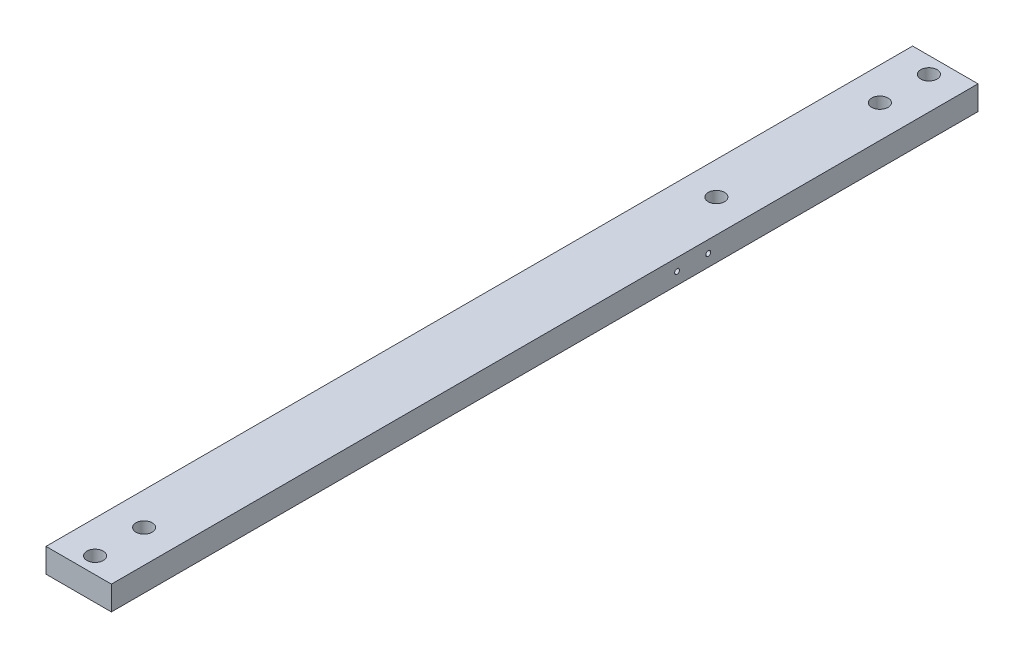
ISO-10303-21;
HEADER;
FILE_DESCRIPTION(('STEP AP214'),'2;1');
FILE_NAME('part.step','',(''),(''),'','','');
FILE_SCHEMA(('AUTOMOTIVE_DESIGN { 1 0 10303 214 1 1 1 1 }'));
ENDSEC;
DATA;
#1=APPLICATION_CONTEXT('core data for automotive mechanical design processes');
#2=APPLICATION_PROTOCOL_DEFINITION('international standard','automotive_design',2000,#1);
#3=PRODUCT_CONTEXT('',#1,'mechanical');
#4=PRODUCT('Part','Part','',(#3));
#5=PRODUCT_RELATED_PRODUCT_CATEGORY('part','',(#4));
#6=PRODUCT_DEFINITION_FORMATION('','',#4);
#7=PRODUCT_DEFINITION_CONTEXT('part definition',#1,'design');
#8=PRODUCT_DEFINITION('design','',#6,#7);
#9=PRODUCT_DEFINITION_SHAPE('','',#8);
#10=(LENGTH_UNIT() NAMED_UNIT(*) SI_UNIT(.MILLI.,.METRE.));
#11=(NAMED_UNIT(*) PLANE_ANGLE_UNIT() SI_UNIT($,.RADIAN.));
#12=(NAMED_UNIT(*) SI_UNIT($,.STERADIAN.) SOLID_ANGLE_UNIT());
#13=UNCERTAINTY_MEASURE_WITH_UNIT(LENGTH_MEASURE(1.E-05),#10,'distance_accuracy_value','');
#14=(GEOMETRIC_REPRESENTATION_CONTEXT(3) GLOBAL_UNCERTAINTY_ASSIGNED_CONTEXT((#13)) GLOBAL_UNIT_ASSIGNED_CONTEXT((#10,
#11,#12)) REPRESENTATION_CONTEXT('',''));
#15=CARTESIAN_POINT('',(0.,0.,0.));
#16=DIRECTION('',(0.,0.,1.));
#17=DIRECTION('',(1.,0.,0.));
#18=AXIS2_PLACEMENT_3D('',#15,#16,#17);
#19=CARTESIAN_POINT('',(4.,0.,8.));
#20=DIRECTION('',(0.,1.,0.));
#21=DIRECTION('',(0.,0.,1.));
#22=AXIS2_PLACEMENT_3D('',#19,#20,#21);
#23=CYLINDRICAL_SURFACE('',#22,0.7);
#24=CARTESIAN_POINT('',(4.,0.,8.));
#25=DIRECTION('',(0.,1.,0.));
#26=DIRECTION('',(0.,0.,1.));
#27=AXIS2_PLACEMENT_3D('',#24,#25,#26);
#28=CIRCLE('',#27,0.7);
#29=CARTESIAN_POINT('',(4.,0.,8.7));
#30=VERTEX_POINT('',#29);
#31=EDGE_CURVE('E138',#30,#30,#28,.T.);
#32=ORIENTED_EDGE('',*,*,#31,.F.);
#33=EDGE_LOOP('',(#32));
#34=FACE_BOUND('',#33,.T.);
#35=CARTESIAN_POINT('',(4.,1.45,8.));
#36=DIRECTION('',(0.,1.,0.));
#37=DIRECTION('',(0.,0.,1.));
#38=AXIS2_PLACEMENT_3D('',#35,#36,#37);
#39=CIRCLE('',#38,0.7);
#40=CARTESIAN_POINT('',(4.,1.45,8.7));
#41=VERTEX_POINT('',#40);
#42=EDGE_CURVE('E39',#41,#41,#39,.F.);
#43=ORIENTED_EDGE('',*,*,#42,.F.);
#44=EDGE_LOOP('',(#43));
#45=FACE_BOUND('',#44,.T.);
#46=ADVANCED_FACE('F35',(#34,#45),#23,.F.);
#47=CARTESIAN_POINT('',(4.00000000000001,0.,98.));
#48=DIRECTION('',(0.,1.,0.));
#49=DIRECTION('',(0.,0.,1.));
#50=AXIS2_PLACEMENT_3D('',#47,#48,#49);
#51=CYLINDRICAL_SURFACE('',#50,0.700000000000013);
#52=CARTESIAN_POINT('',(4.00000000000001,0.,98.));
#53=DIRECTION('',(0.,1.,0.));
#54=DIRECTION('',(0.,0.,1.));
#55=AXIS2_PLACEMENT_3D('',#52,#53,#54);
#56=CIRCLE('',#55,0.700000000000013);
#57=CARTESIAN_POINT('',(4.00000000000001,0.,98.7));
#58=VERTEX_POINT('',#57);
#59=EDGE_CURVE('E134',#58,#58,#56,.T.);
#60=ORIENTED_EDGE('',*,*,#59,.F.);
#61=EDGE_LOOP('',(#60));
#62=FACE_BOUND('',#61,.T.);
#63=CARTESIAN_POINT('',(4.00000000000001,1.45,98.));
#64=DIRECTION('',(0.,1.,0.));
#65=DIRECTION('',(0.,0.,1.));
#66=AXIS2_PLACEMENT_3D('',#63,#64,#65);
#67=CIRCLE('',#66,0.700000000000013);
#68=CARTESIAN_POINT('',(4.00000000000001,1.45,98.7));
#69=VERTEX_POINT('',#68);
#70=EDGE_CURVE('E120',#69,#69,#67,.F.);
#71=ORIENTED_EDGE('',*,*,#70,.F.);
#72=EDGE_LOOP('',(#71));
#73=FACE_BOUND('',#72,.T.);
#74=ADVANCED_FACE('F147',(#62,#73),#51,.F.);
#75=CARTESIAN_POINT('',(4.00000000000001,0.,104.));
#76=DIRECTION('',(0.,1.,0.));
#77=DIRECTION('',(0.,0.,1.));
#78=AXIS2_PLACEMENT_3D('',#75,#76,#77);
#79=CYLINDRICAL_SURFACE('',#78,0.700000000000011);
#80=CARTESIAN_POINT('',(4.00000000000001,0.,104.));
#81=DIRECTION('',(0.,1.,0.));
#82=DIRECTION('',(0.,0.,1.));
#83=AXIS2_PLACEMENT_3D('',#80,#81,#82);
#84=CIRCLE('',#83,0.700000000000011);
#85=CARTESIAN_POINT('',(4.00000000000001,0.,104.7));
#86=VERTEX_POINT('',#85);
#87=EDGE_CURVE('E129',#86,#86,#84,.T.);
#88=ORIENTED_EDGE('',*,*,#87,.F.);
#89=EDGE_LOOP('',(#88));
#90=FACE_BOUND('',#89,.T.);
#91=CARTESIAN_POINT('',(4.00000000000001,1.45,104.));
#92=DIRECTION('',(0.,1.,0.));
#93=DIRECTION('',(0.,0.,1.));
#94=AXIS2_PLACEMENT_3D('',#91,#92,#93);
#95=CIRCLE('',#94,0.700000000000011);
#96=CARTESIAN_POINT('',(4.00000000000001,1.45,104.7));
#97=VERTEX_POINT('',#96);
#98=EDGE_CURVE('E118',#97,#97,#95,.F.);
#99=ORIENTED_EDGE('',*,*,#98,.F.);
#100=EDGE_LOOP('',(#99));
#101=FACE_BOUND('',#100,.T.);
#102=ADVANCED_FACE('F150',(#90,#101),#79,.F.);
#103=CARTESIAN_POINT('',(4.00000000000001,0.,28.));
#104=DIRECTION('',(0.,1.,0.));
#105=DIRECTION('',(0.,0.,1.));
#106=AXIS2_PLACEMENT_3D('',#103,#104,#105);
#107=CYLINDRICAL_SURFACE('',#106,0.699999999999999);
#108=CARTESIAN_POINT('',(4.00000000000001,0.,28.));
#109=DIRECTION('',(0.,1.,0.));
#110=DIRECTION('',(0.,0.,1.));
#111=AXIS2_PLACEMENT_3D('',#108,#109,#110);
#112=CIRCLE('',#111,0.699999999999999);
#113=CARTESIAN_POINT('',(4.00000000000001,0.,28.7));
#114=VERTEX_POINT('',#113);
#115=EDGE_CURVE('E125',#114,#114,#112,.T.);
#116=ORIENTED_EDGE('',*,*,#115,.F.);
#117=EDGE_LOOP('',(#116));
#118=FACE_BOUND('',#117,.T.);
#119=CARTESIAN_POINT('',(4.00000000000001,1.45,28.));
#120=DIRECTION('',(0.,1.,0.));
#121=DIRECTION('',(0.,0.,1.));
#122=AXIS2_PLACEMENT_3D('',#119,#120,#121);
#123=CIRCLE('',#122,0.699999999999999);
#124=CARTESIAN_POINT('',(4.00000000000001,1.45,28.7));
#125=VERTEX_POINT('',#124);
#126=EDGE_CURVE('E114',#125,#125,#123,.F.);
#127=ORIENTED_EDGE('',*,*,#126,.F.);
#128=EDGE_LOOP('',(#127));
#129=FACE_BOUND('',#128,.T.);
#130=ADVANCED_FACE('F156',(#118,#129),#107,.F.);
#131=CARTESIAN_POINT('',(4.,0.,2.));
#132=DIRECTION('',(0.,1.,0.));
#133=DIRECTION('',(0.,0.,1.));
#134=AXIS2_PLACEMENT_3D('',#131,#132,#133);
#135=CYLINDRICAL_SURFACE('',#134,0.7);
#136=CARTESIAN_POINT('',(4.,0.,2.));
#137=DIRECTION('',(0.,1.,0.));
#138=DIRECTION('',(0.,0.,1.));
#139=AXIS2_PLACEMENT_3D('',#136,#137,#138);
#140=CIRCLE('',#139,0.7);
#141=CARTESIAN_POINT('',(4.,0.,2.7));
#142=VERTEX_POINT('',#141);
#143=EDGE_CURVE('E105',#142,#142,#140,.T.);
#144=ORIENTED_EDGE('',*,*,#143,.F.);
#145=EDGE_LOOP('',(#144));
#146=FACE_BOUND('',#145,.T.);
#147=CARTESIAN_POINT('',(4.,1.45,2.));
#148=DIRECTION('',(0.,1.,0.));
#149=DIRECTION('',(0.,0.,1.));
#150=AXIS2_PLACEMENT_3D('',#147,#148,#149);
#151=CIRCLE('',#150,0.7);
#152=CARTESIAN_POINT('',(4.,1.45,2.7));
#153=VERTEX_POINT('',#152);
#154=EDGE_CURVE('E111',#153,#153,#151,.F.);
#155=ORIENTED_EDGE('',*,*,#154,.F.);
#156=EDGE_LOOP('',(#155));
#157=FACE_BOUND('',#156,.T.);
#158=ADVANCED_FACE('F179',(#146,#157),#135,.F.);
#159=CARTESIAN_POINT('',(0.,2.95,0.));
#160=DIRECTION('',(1.,0.,0.));
#161=DIRECTION('',(0.,0.,-1.));
#162=AXIS2_PLACEMENT_3D('',#159,#160,#161);
#163=PLANE('',#162);
#164=CARTESIAN_POINT('',(0.,1.47500000004995,33.));
#165=DIRECTION('',(1.,0.,0.));
#166=DIRECTION('',(0.,0.,-1.));
#167=AXIS2_PLACEMENT_3D('',#164,#165,#166);
#168=CIRCLE('',#167,0.300000000000004);
#169=CARTESIAN_POINT('',(0.,1.47500000004995,32.7));
#170=VERTEX_POINT('',#169);
#171=EDGE_CURVE('E189',#170,#170,#168,.T.);
#172=ORIENTED_EDGE('',*,*,#171,.T.);
#173=EDGE_LOOP('',(#172));
#174=FACE_BOUND('',#173,.T.);
#175=CARTESIAN_POINT('',(0.,1.47500000004995,36.8));
#176=DIRECTION('',(1.,0.,0.));
#177=DIRECTION('',(0.,0.,-1.));
#178=AXIS2_PLACEMENT_3D('',#175,#176,#177);
#179=CIRCLE('',#178,0.300000000000004);
#180=CARTESIAN_POINT('',(0.,1.47500000004995,36.5));
#181=VERTEX_POINT('',#180);
#182=EDGE_CURVE('E193',#181,#181,#179,.T.);
#183=ORIENTED_EDGE('',*,*,#182,.T.);
#184=EDGE_LOOP('',(#183));
#185=FACE_BOUND('',#184,.T.);
#186=DIRECTION('',(0.,0.,1.));
#187=VECTOR('',#186,1.);
#188=CARTESIAN_POINT('',(0.,0.,0.));
#189=LINE('',#188,#187);
#190=CARTESIAN_POINT('',(0.,0.,0.));
#191=VERTEX_POINT('',#190);
#192=CARTESIAN_POINT('',(0.,0.,106.));
#193=VERTEX_POINT('',#192);
#194=EDGE_CURVE('E102',#191,#193,#189,.T.);
#195=ORIENTED_EDGE('',*,*,#194,.T.);
#196=DIRECTION('',(0.,-1.,0.));
#197=VECTOR('',#196,1.);
#198=CARTESIAN_POINT('',(0.,2.95,106.));
#199=LINE('',#198,#197);
#200=CARTESIAN_POINT('',(0.,2.95,106.));
#201=VERTEX_POINT('',#200);
#202=EDGE_CURVE('E11',#201,#193,#199,.T.);
#203=ORIENTED_EDGE('',*,*,#202,.F.);
#204=DIRECTION('',(0.,0.,1.));
#205=VECTOR('',#204,1.);
#206=CARTESIAN_POINT('',(0.,2.95,0.));
#207=LINE('',#206,#205);
#208=CARTESIAN_POINT('',(0.,2.95,0.));
#209=VERTEX_POINT('',#208);
#210=EDGE_CURVE('E89',#209,#201,#207,.T.);
#211=ORIENTED_EDGE('',*,*,#210,.F.);
#212=DIRECTION('',(0.,-1.,0.));
#213=VECTOR('',#212,1.);
#214=CARTESIAN_POINT('',(0.,2.95,0.));
#215=LINE('',#214,#213);
#216=EDGE_CURVE('E98',#209,#191,#215,.T.);
#217=ORIENTED_EDGE('',*,*,#216,.T.);
#218=EDGE_LOOP('',(#195,#203,#211,#217));
#219=FACE_BOUND('',#218,.T.);
#220=ADVANCED_FACE('F37',(#174,#185,#219),#163,.F.);
#221=CARTESIAN_POINT('',(0.,2.95,106.));
#222=DIRECTION('',(0.,0.,-1.));
#223=DIRECTION('',(-1.,0.,0.));
#224=AXIS2_PLACEMENT_3D('',#221,#222,#223);
#225=PLANE('',#224);
#226=DIRECTION('',(1.,0.,0.));
#227=VECTOR('',#226,1.);
#228=CARTESIAN_POINT('',(0.,0.,106.));
#229=LINE('',#228,#227);
#230=CARTESIAN_POINT('',(8.00000000000001,0.,106.));
#231=VERTEX_POINT('',#230);
#232=EDGE_CURVE('E93',#193,#231,#229,.T.);
#233=ORIENTED_EDGE('',*,*,#232,.T.);
#234=DIRECTION('',(0.,-1.,0.));
#235=VECTOR('',#234,1.);
#236=CARTESIAN_POINT('',(8.00000000000001,2.95,106.));
#237=LINE('',#236,#235);
#238=CARTESIAN_POINT('',(8.00000000000001,2.95,106.));
#239=VERTEX_POINT('',#238);
#240=EDGE_CURVE('E45',#239,#231,#237,.T.);
#241=ORIENTED_EDGE('',*,*,#240,.F.);
#242=DIRECTION('',(1.,0.,0.));
#243=VECTOR('',#242,1.);
#244=CARTESIAN_POINT('',(0.,2.95,106.));
#245=LINE('',#244,#243);
#246=EDGE_CURVE('E84',#201,#239,#245,.T.);
#247=ORIENTED_EDGE('',*,*,#246,.F.);
#248=ORIENTED_EDGE('',*,*,#202,.T.);
#249=EDGE_LOOP('',(#233,#241,#247,#248));
#250=FACE_BOUND('',#249,.T.);
#251=ADVANCED_FACE('F92',(#250),#225,.F.);
#252=CARTESIAN_POINT('',(8.,2.95,0.));
#253=DIRECTION('',(-1.,0.,0.));
#254=DIRECTION('',(0.,0.,1.));
#255=AXIS2_PLACEMENT_3D('',#252,#253,#254);
#256=PLANE('',#255);
#257=CARTESIAN_POINT('',(8.,1.47500000004995,33.));
#258=DIRECTION('',(1.,0.,0.));
#259=DIRECTION('',(0.,0.,-1.));
#260=AXIS2_PLACEMENT_3D('',#257,#258,#259);
#261=CIRCLE('',#260,0.300000000000004);
#262=CARTESIAN_POINT('',(8.,1.47500000004995,32.7));
#263=VERTEX_POINT('',#262);
#264=EDGE_CURVE('E200',#263,#263,#261,.T.);
#265=ORIENTED_EDGE('',*,*,#264,.F.);
#266=EDGE_LOOP('',(#265));
#267=FACE_BOUND('',#266,.T.);
#268=CARTESIAN_POINT('',(8.,1.47500000004995,36.8));
#269=DIRECTION('',(1.,0.,0.));
#270=DIRECTION('',(0.,0.,-1.));
#271=AXIS2_PLACEMENT_3D('',#268,#269,#270);
#272=CIRCLE('',#271,0.300000000000004);
#273=CARTESIAN_POINT('',(8.,1.47500000004995,36.5));
#274=VERTEX_POINT('',#273);
#275=EDGE_CURVE('E197',#274,#274,#272,.T.);
#276=ORIENTED_EDGE('',*,*,#275,.F.);
#277=EDGE_LOOP('',(#276));
#278=FACE_BOUND('',#277,.T.);
#279=DIRECTION('',(0.,0.,-1.));
#280=VECTOR('',#279,1.);
#281=CARTESIAN_POINT('',(8.,0.,0.));
#282=LINE('',#281,#280);
#283=CARTESIAN_POINT('',(8.,0.,0.));
#284=VERTEX_POINT('',#283);
#285=EDGE_CURVE('E71',#231,#284,#282,.T.);
#286=ORIENTED_EDGE('',*,*,#285,.T.);
#287=DIRECTION('',(0.,-1.,0.));
#288=VECTOR('',#287,1.);
#289=CARTESIAN_POINT('',(8.,2.95,0.));
#290=LINE('',#289,#288);
#291=CARTESIAN_POINT('',(8.,2.95,0.));
#292=VERTEX_POINT('',#291);
#293=EDGE_CURVE('E94',#292,#284,#290,.T.);
#294=ORIENTED_EDGE('',*,*,#293,.F.);
#295=DIRECTION('',(0.,0.,-1.));
#296=VECTOR('',#295,1.);
#297=CARTESIAN_POINT('',(8.,2.95,0.));
#298=LINE('',#297,#296);
#299=EDGE_CURVE('E87',#239,#292,#298,.T.);
#300=ORIENTED_EDGE('',*,*,#299,.F.);
#301=ORIENTED_EDGE('',*,*,#240,.T.);
#302=EDGE_LOOP('',(#286,#294,#300,#301));
#303=FACE_BOUND('',#302,.T.);
#304=ADVANCED_FACE('F96',(#267,#278,#303),#256,.F.);
#305=CARTESIAN_POINT('',(0.,2.95,0.));
#306=DIRECTION('',(0.,0.,1.));
#307=DIRECTION('',(1.,0.,0.));
#308=AXIS2_PLACEMENT_3D('',#305,#306,#307);
#309=PLANE('',#308);
#310=DIRECTION('',(-1.,0.,0.));
#311=VECTOR('',#310,1.);
#312=CARTESIAN_POINT('',(0.,0.,0.));
#313=LINE('',#312,#311);
#314=EDGE_CURVE('E77',#284,#191,#313,.T.);
#315=ORIENTED_EDGE('',*,*,#314,.T.);
#316=ORIENTED_EDGE('',*,*,#216,.F.);
#317=DIRECTION('',(-1.,0.,0.));
#318=VECTOR('',#317,1.);
#319=CARTESIAN_POINT('',(0.,2.95,0.));
#320=LINE('',#319,#318);
#321=EDGE_CURVE('E54',#292,#209,#320,.T.);
#322=ORIENTED_EDGE('',*,*,#321,.F.);
#323=ORIENTED_EDGE('',*,*,#293,.T.);
#324=EDGE_LOOP('',(#315,#316,#322,#323));
#325=FACE_BOUND('',#324,.T.);
#326=ADVANCED_FACE('F165',(#325),#309,.F.);
#327=CARTESIAN_POINT('',(0.,2.95,0.));
#328=DIRECTION('',(0.,1.,0.));
#329=DIRECTION('',(0.,0.,1.));
#330=AXIS2_PLACEMENT_3D('',#327,#328,#329);
#331=PLANE('',#330);
#332=CARTESIAN_POINT('',(4.,2.95,2.));
#333=DIRECTION('',(0.,1.,0.));
#334=DIRECTION('',(0.,0.,1.));
#335=AXIS2_PLACEMENT_3D('',#332,#333,#334);
#336=CIRCLE('',#335,1.);
#337=CARTESIAN_POINT('',(4.,2.95,3.));
#338=VERTEX_POINT('',#337);
#339=EDGE_CURVE('E217',#338,#338,#336,.T.);
#340=ORIENTED_EDGE('',*,*,#339,.F.);
#341=EDGE_LOOP('',(#340));
#342=FACE_BOUND('',#341,.T.);
#343=CARTESIAN_POINT('',(4.00000000000001,2.95,104.));
#344=DIRECTION('',(0.,1.,0.));
#345=DIRECTION('',(0.,0.,1.));
#346=AXIS2_PLACEMENT_3D('',#343,#344,#345);
#347=CIRCLE('',#346,0.999999999999998);
#348=CARTESIAN_POINT('',(4.00000000000001,2.95,105.));
#349=VERTEX_POINT('',#348);
#350=EDGE_CURVE('E224',#349,#349,#347,.T.);
#351=ORIENTED_EDGE('',*,*,#350,.F.);
#352=EDGE_LOOP('',(#351));
#353=FACE_BOUND('',#352,.T.);
#354=CARTESIAN_POINT('',(4.00000000000001,2.95,98.));
#355=DIRECTION('',(0.,1.,0.));
#356=DIRECTION('',(0.,0.,1.));
#357=AXIS2_PLACEMENT_3D('',#354,#355,#356);
#358=CIRCLE('',#357,1.);
#359=CARTESIAN_POINT('',(4.00000000000001,2.95,99.));
#360=VERTEX_POINT('',#359);
#361=EDGE_CURVE('E204',#360,#360,#358,.T.);
#362=ORIENTED_EDGE('',*,*,#361,.F.);
#363=EDGE_LOOP('',(#362));
#364=FACE_BOUND('',#363,.T.);
#365=CARTESIAN_POINT('',(4.00000000000001,2.95,28.));
#366=DIRECTION('',(0.,1.,0.));
#367=DIRECTION('',(0.,0.,1.));
#368=AXIS2_PLACEMENT_3D('',#365,#366,#367);
#369=CIRCLE('',#368,1.);
#370=CARTESIAN_POINT('',(4.00000000000001,2.95,29.));
#371=VERTEX_POINT('',#370);
#372=EDGE_CURVE('E211',#371,#371,#369,.T.);
#373=ORIENTED_EDGE('',*,*,#372,.F.);
#374=EDGE_LOOP('',(#373));
#375=FACE_BOUND('',#374,.T.);
#376=CARTESIAN_POINT('',(4.,2.95,8.));
#377=DIRECTION('',(0.,1.,0.));
#378=DIRECTION('',(0.,0.,1.));
#379=AXIS2_PLACEMENT_3D('',#376,#377,#378);
#380=CIRCLE('',#379,1.);
#381=CARTESIAN_POINT('',(4.,2.95,9.));
#382=VERTEX_POINT('',#381);
#383=EDGE_CURVE('E220',#382,#382,#380,.T.);
#384=ORIENTED_EDGE('',*,*,#383,.F.);
#385=EDGE_LOOP('',(#384));
#386=FACE_BOUND('',#385,.T.);
#387=ORIENTED_EDGE('',*,*,#210,.T.);
#388=ORIENTED_EDGE('',*,*,#246,.T.);
#389=ORIENTED_EDGE('',*,*,#299,.T.);
#390=ORIENTED_EDGE('',*,*,#321,.T.);
#391=EDGE_LOOP('',(#387,#388,#389,#390));
#392=FACE_BOUND('',#391,.T.);
#393=ADVANCED_FACE('F85',(#342,#353,#364,#375,#386,#392),#331,.T.);
#394=CARTESIAN_POINT('',(0.,0.,0.));
#395=DIRECTION('',(0.,1.,0.));
#396=DIRECTION('',(0.,0.,1.));
#397=AXIS2_PLACEMENT_3D('',#394,#395,#396);
#398=PLANE('',#397);
#399=ORIENTED_EDGE('',*,*,#143,.T.);
#400=EDGE_LOOP('',(#399));
#401=FACE_BOUND('',#400,.T.);
#402=ORIENTED_EDGE('',*,*,#115,.T.);
#403=EDGE_LOOP('',(#402));
#404=FACE_BOUND('',#403,.T.);
#405=ORIENTED_EDGE('',*,*,#87,.T.);
#406=EDGE_LOOP('',(#405));
#407=FACE_BOUND('',#406,.T.);
#408=ORIENTED_EDGE('',*,*,#59,.T.);
#409=EDGE_LOOP('',(#408));
#410=FACE_BOUND('',#409,.T.);
#411=ORIENTED_EDGE('',*,*,#31,.T.);
#412=EDGE_LOOP('',(#411));
#413=FACE_BOUND('',#412,.T.);
#414=ORIENTED_EDGE('',*,*,#194,.F.);
#415=ORIENTED_EDGE('',*,*,#314,.F.);
#416=ORIENTED_EDGE('',*,*,#285,.F.);
#417=ORIENTED_EDGE('',*,*,#232,.F.);
#418=EDGE_LOOP('',(#414,#415,#416,#417));
#419=FACE_BOUND('',#418,.T.);
#420=ADVANCED_FACE('F144',(#401,#404,#407,#410,#413,#419),#398,.F.);
#421=CARTESIAN_POINT('',(4.,1.45,2.));
#422=DIRECTION('',(0.,1.,0.));
#423=DIRECTION('',(0.,0.,1.));
#424=AXIS2_PLACEMENT_3D('',#421,#422,#423);
#425=PLANE('',#424);
#426=CARTESIAN_POINT('',(4.,1.45,2.));
#427=DIRECTION('',(0.,1.,0.));
#428=DIRECTION('',(0.,0.,1.));
#429=AXIS2_PLACEMENT_3D('',#426,#427,#428);
#430=CIRCLE('',#429,1.);
#431=CARTESIAN_POINT('',(4.,1.45,3.));
#432=VERTEX_POINT('',#431);
#433=EDGE_CURVE('E221',#432,#432,#430,.T.);
#434=ORIENTED_EDGE('',*,*,#433,.T.);
#435=EDGE_LOOP('',(#434));
#436=FACE_BOUND('',#435,.T.);
#437=ORIENTED_EDGE('',*,*,#154,.T.);
#438=EDGE_LOOP('',(#437));
#439=FACE_BOUND('',#438,.T.);
#440=ADVANCED_FACE('F169',(#436,#439),#425,.T.);
#441=CARTESIAN_POINT('',(4.,1.45,2.));
#442=DIRECTION('',(0.,1.,0.));
#443=DIRECTION('',(0.,0.,1.));
#444=AXIS2_PLACEMENT_3D('',#441,#442,#443);
#445=CYLINDRICAL_SURFACE('',#444,1.);
#446=ORIENTED_EDGE('',*,*,#433,.F.);
#447=EDGE_LOOP('',(#446));
#448=FACE_BOUND('',#447,.T.);
#449=ORIENTED_EDGE('',*,*,#339,.T.);
#450=EDGE_LOOP('',(#449));
#451=FACE_BOUND('',#450,.T.);
#452=ADVANCED_FACE('F238',(#448,#451),#445,.F.);
#453=CARTESIAN_POINT('',(4.00000000000001,1.45,28.));
#454=DIRECTION('',(0.,1.,0.));
#455=DIRECTION('',(0.,0.,1.));
#456=AXIS2_PLACEMENT_3D('',#453,#454,#455);
#457=PLANE('',#456);
#458=CARTESIAN_POINT('',(4.00000000000001,1.45,28.));
#459=DIRECTION('',(0.,1.,0.));
#460=DIRECTION('',(0.,0.,1.));
#461=AXIS2_PLACEMENT_3D('',#458,#459,#460);
#462=CIRCLE('',#461,1.);
#463=CARTESIAN_POINT('',(4.00000000000001,1.45,29.));
#464=VERTEX_POINT('',#463);
#465=EDGE_CURVE('E214',#464,#464,#462,.T.);
#466=ORIENTED_EDGE('',*,*,#465,.T.);
#467=EDGE_LOOP('',(#466));
#468=FACE_BOUND('',#467,.T.);
#469=ORIENTED_EDGE('',*,*,#126,.T.);
#470=EDGE_LOOP('',(#469));
#471=FACE_BOUND('',#470,.T.);
#472=ADVANCED_FACE('F244',(#468,#471),#457,.T.);
#473=CARTESIAN_POINT('',(4.00000000000001,1.45,28.));
#474=DIRECTION('',(0.,1.,0.));
#475=DIRECTION('',(0.,0.,1.));
#476=AXIS2_PLACEMENT_3D('',#473,#474,#475);
#477=CYLINDRICAL_SURFACE('',#476,1.);
#478=ORIENTED_EDGE('',*,*,#465,.F.);
#479=EDGE_LOOP('',(#478));
#480=FACE_BOUND('',#479,.T.);
#481=ORIENTED_EDGE('',*,*,#372,.T.);
#482=EDGE_LOOP('',(#481));
#483=FACE_BOUND('',#482,.T.);
#484=ADVANCED_FACE('F257',(#480,#483),#477,.F.);
#485=CARTESIAN_POINT('',(4.00000000000001,1.45,104.));
#486=DIRECTION('',(0.,1.,0.));
#487=DIRECTION('',(0.,0.,1.));
#488=AXIS2_PLACEMENT_3D('',#485,#486,#487);
#489=PLANE('',#488);
#490=CARTESIAN_POINT('',(4.00000000000001,1.45,104.));
#491=DIRECTION('',(0.,1.,0.));
#492=DIRECTION('',(0.,0.,1.));
#493=AXIS2_PLACEMENT_3D('',#490,#491,#492);
#494=CIRCLE('',#493,0.999999999999998);
#495=CARTESIAN_POINT('',(4.00000000000001,1.45,105.));
#496=VERTEX_POINT('',#495);
#497=EDGE_CURVE('E207',#496,#496,#494,.T.);
#498=ORIENTED_EDGE('',*,*,#497,.T.);
#499=EDGE_LOOP('',(#498));
#500=FACE_BOUND('',#499,.T.);
#501=ORIENTED_EDGE('',*,*,#98,.T.);
#502=EDGE_LOOP('',(#501));
#503=FACE_BOUND('',#502,.T.);
#504=ADVANCED_FACE('F253',(#500,#503),#489,.T.);
#505=CARTESIAN_POINT('',(4.00000000000001,1.45,104.));
#506=DIRECTION('',(0.,1.,0.));
#507=DIRECTION('',(0.,0.,1.));
#508=AXIS2_PLACEMENT_3D('',#505,#506,#507);
#509=CYLINDRICAL_SURFACE('',#508,0.999999999999998);
#510=ORIENTED_EDGE('',*,*,#497,.F.);
#511=EDGE_LOOP('',(#510));
#512=FACE_BOUND('',#511,.T.);
#513=ORIENTED_EDGE('',*,*,#350,.T.);
#514=EDGE_LOOP('',(#513));
#515=FACE_BOUND('',#514,.T.);
#516=ADVANCED_FACE('F249',(#512,#515),#509,.F.);
#517=CARTESIAN_POINT('',(4.00000000000001,1.45,98.));
#518=DIRECTION('',(0.,1.,0.));
#519=DIRECTION('',(0.,0.,1.));
#520=AXIS2_PLACEMENT_3D('',#517,#518,#519);
#521=PLANE('',#520);
#522=CARTESIAN_POINT('',(4.00000000000001,1.45,98.));
#523=DIRECTION('',(0.,1.,0.));
#524=DIRECTION('',(0.,0.,1.));
#525=AXIS2_PLACEMENT_3D('',#522,#523,#524);
#526=CIRCLE('',#525,1.);
#527=CARTESIAN_POINT('',(4.00000000000001,1.45,99.));
#528=VERTEX_POINT('',#527);
#529=EDGE_CURVE('E208',#528,#528,#526,.T.);
#530=ORIENTED_EDGE('',*,*,#529,.T.);
#531=EDGE_LOOP('',(#530));
#532=FACE_BOUND('',#531,.T.);
#533=ORIENTED_EDGE('',*,*,#70,.T.);
#534=EDGE_LOOP('',(#533));
#535=FACE_BOUND('',#534,.T.);
#536=ADVANCED_FACE('F252',(#532,#535),#521,.T.);
#537=CARTESIAN_POINT('',(4.00000000000001,1.45,98.));
#538=DIRECTION('',(0.,1.,0.));
#539=DIRECTION('',(0.,0.,1.));
#540=AXIS2_PLACEMENT_3D('',#537,#538,#539);
#541=CYLINDRICAL_SURFACE('',#540,1.);
#542=ORIENTED_EDGE('',*,*,#529,.F.);
#543=EDGE_LOOP('',(#542));
#544=FACE_BOUND('',#543,.T.);
#545=ORIENTED_EDGE('',*,*,#361,.T.);
#546=EDGE_LOOP('',(#545));
#547=FACE_BOUND('',#546,.T.);
#548=ADVANCED_FACE('F263',(#544,#547),#541,.F.);
#549=CARTESIAN_POINT('',(4.,1.45,8.));
#550=DIRECTION('',(0.,1.,0.));
#551=DIRECTION('',(0.,0.,1.));
#552=AXIS2_PLACEMENT_3D('',#549,#550,#551);
#553=PLANE('',#552);
#554=CARTESIAN_POINT('',(4.,1.45,8.));
#555=DIRECTION('',(0.,1.,0.));
#556=DIRECTION('',(0.,0.,1.));
#557=AXIS2_PLACEMENT_3D('',#554,#555,#556);
#558=CIRCLE('',#557,1.);
#559=CARTESIAN_POINT('',(4.,1.45,9.));
#560=VERTEX_POINT('',#559);
#561=EDGE_CURVE('E115',#560,#560,#558,.T.);
#562=ORIENTED_EDGE('',*,*,#561,.T.);
#563=EDGE_LOOP('',(#562));
#564=FACE_BOUND('',#563,.T.);
#565=ORIENTED_EDGE('',*,*,#42,.T.);
#566=EDGE_LOOP('',(#565));
#567=FACE_BOUND('',#566,.T.);
#568=ADVANCED_FACE('F259',(#564,#567),#553,.T.);
#569=CARTESIAN_POINT('',(4.,1.45,8.));
#570=DIRECTION('',(0.,1.,0.));
#571=DIRECTION('',(0.,0.,1.));
#572=AXIS2_PLACEMENT_3D('',#569,#570,#571);
#573=CYLINDRICAL_SURFACE('',#572,1.);
#574=ORIENTED_EDGE('',*,*,#561,.F.);
#575=EDGE_LOOP('',(#574));
#576=FACE_BOUND('',#575,.T.);
#577=ORIENTED_EDGE('',*,*,#383,.T.);
#578=EDGE_LOOP('',(#577));
#579=FACE_BOUND('',#578,.T.);
#580=ADVANCED_FACE('F262',(#576,#579),#573,.F.);
#581=CARTESIAN_POINT('',(0.,1.47500000004995,36.8));
#582=DIRECTION('',(1.,0.,0.));
#583=DIRECTION('',(0.,0.,-1.));
#584=AXIS2_PLACEMENT_3D('',#581,#582,#583);
#585=CYLINDRICAL_SURFACE('',#584,0.300000000000004);
#586=ORIENTED_EDGE('',*,*,#182,.F.);
#587=EDGE_LOOP('',(#586));
#588=FACE_BOUND('',#587,.T.);
#589=ORIENTED_EDGE('',*,*,#275,.T.);
#590=EDGE_LOOP('',(#589));
#591=FACE_BOUND('',#590,.T.);
#592=ADVANCED_FACE('F266',(#588,#591),#585,.F.);
#593=CARTESIAN_POINT('',(0.,1.47500000004995,33.));
#594=DIRECTION('',(1.,0.,0.));
#595=DIRECTION('',(0.,0.,-1.));
#596=AXIS2_PLACEMENT_3D('',#593,#594,#595);
#597=CYLINDRICAL_SURFACE('',#596,0.300000000000004);
#598=ORIENTED_EDGE('',*,*,#171,.F.);
#599=EDGE_LOOP('',(#598));
#600=FACE_BOUND('',#599,.T.);
#601=ORIENTED_EDGE('',*,*,#264,.T.);
#602=EDGE_LOOP('',(#601));
#603=FACE_BOUND('',#602,.T.);
#604=ADVANCED_FACE('F291',(#600,#603),#597,.F.);
#605=CLOSED_SHELL('',(#46,#74,#102,#130,#158,#220,#251,#304,#326,#393,#420,#440,#452,#472,#484,
#504,#516,#536,#548,#568,#580,#592,#604));
#606=MANIFOLD_SOLID_BREP('B2',#605);
#607=ADVANCED_BREP_SHAPE_REPRESENTATION('',(#18,#606),#14);
#608=SHAPE_DEFINITION_REPRESENTATION(#9,#607);
ENDSEC;
END-ISO-10303-21;
